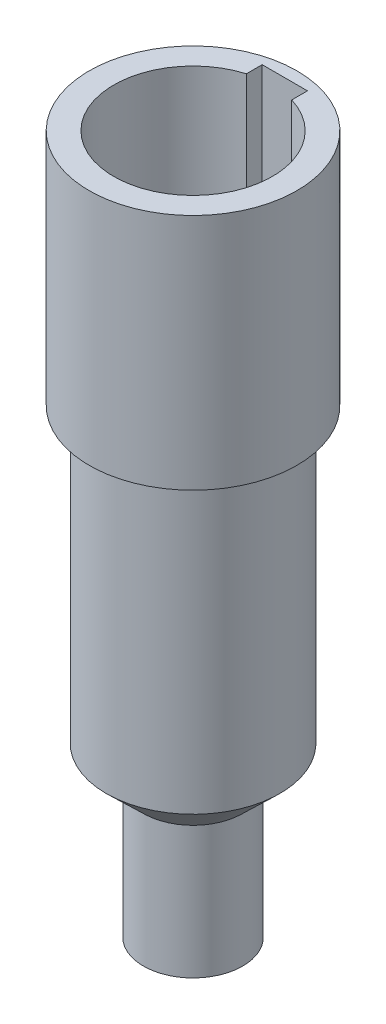
ISO-10303-21;
HEADER;
FILE_DESCRIPTION(('STEP AP214'),'2;1');
FILE_NAME('part.step','',(''),(''),'','','');
FILE_SCHEMA(('AUTOMOTIVE_DESIGN { 1 0 10303 214 1 1 1 1 }'));
ENDSEC;
DATA;
#1=APPLICATION_CONTEXT('core data for automotive mechanical design processes');
#2=APPLICATION_PROTOCOL_DEFINITION('international standard','automotive_design',2000,#1);
#3=PRODUCT_CONTEXT('',#1,'mechanical');
#4=PRODUCT('Part','Part','',(#3));
#5=PRODUCT_RELATED_PRODUCT_CATEGORY('part','',(#4));
#6=PRODUCT_DEFINITION_FORMATION('','',#4);
#7=PRODUCT_DEFINITION_CONTEXT('part definition',#1,'design');
#8=PRODUCT_DEFINITION('design','',#6,#7);
#9=PRODUCT_DEFINITION_SHAPE('','',#8);
#10=(LENGTH_UNIT() NAMED_UNIT(*) SI_UNIT(.MILLI.,.METRE.));
#11=(NAMED_UNIT(*) PLANE_ANGLE_UNIT() SI_UNIT($,.RADIAN.));
#12=(NAMED_UNIT(*) SI_UNIT($,.STERADIAN.) SOLID_ANGLE_UNIT());
#13=UNCERTAINTY_MEASURE_WITH_UNIT(LENGTH_MEASURE(1.E-05),#10,'distance_accuracy_value','');
#14=(GEOMETRIC_REPRESENTATION_CONTEXT(3) GLOBAL_UNCERTAINTY_ASSIGNED_CONTEXT((#13)) GLOBAL_UNIT_ASSIGNED_CONTEXT((#10,
#11,#12)) REPRESENTATION_CONTEXT('',''));
#15=CARTESIAN_POINT('',(0.,0.,0.));
#16=DIRECTION('',(0.,0.,1.));
#17=DIRECTION('',(1.,0.,0.));
#18=AXIS2_PLACEMENT_3D('',#15,#16,#17);
#19=CARTESIAN_POINT('',(0.,0.,0.));
#20=DIRECTION('',(0.,1.,0.));
#21=DIRECTION('',(0.,0.,1.));
#22=AXIS2_PLACEMENT_3D('',#19,#20,#21);
#23=PLANE('',#22);
#24=CARTESIAN_POINT('',(0.,0.,0.));
#25=DIRECTION('',(0.,-1.,0.));
#26=DIRECTION('',(0.,0.,-1.));
#27=AXIS2_PLACEMENT_3D('',#24,#25,#26);
#28=CIRCLE('',#27,13.15);
#29=CARTESIAN_POINT('',(0.,0.,-13.15));
#30=VERTEX_POINT('',#29);
#31=EDGE_CURVE('E13',#30,#30,#28,.T.);
#32=ORIENTED_EDGE('',*,*,#31,.T.);
#33=EDGE_LOOP('',(#32));
#34=FACE_BOUND('',#33,.T.);
#35=ADVANCED_FACE('F44',(#34),#23,.F.);
#36=CARTESIAN_POINT('',(0.,0.,0.));
#37=DIRECTION('',(0.,-1.,0.));
#38=DIRECTION('',(0.,0.,-1.));
#39=AXIS2_PLACEMENT_3D('',#36,#37,#38);
#40=CYLINDRICAL_SURFACE('',#39,13.15);
#41=ORIENTED_EDGE('',*,*,#31,.F.);
#42=EDGE_LOOP('',(#41));
#43=FACE_BOUND('',#42,.T.);
#44=CARTESIAN_POINT('',(0.,35.,0.));
#45=DIRECTION('',(0.,-1.,0.));
#46=DIRECTION('',(0.,0.,-1.));
#47=AXIS2_PLACEMENT_3D('',#44,#45,#46);
#48=CIRCLE('',#47,13.15);
#49=CARTESIAN_POINT('',(0.,35.,-13.15));
#50=VERTEX_POINT('',#49);
#51=EDGE_CURVE('E51',#50,#50,#48,.T.);
#52=ORIENTED_EDGE('',*,*,#51,.T.);
#53=EDGE_LOOP('',(#52));
#54=FACE_BOUND('',#53,.T.);
#55=ADVANCED_FACE('F134',(#43,#54),#40,.T.);
#56=CARTESIAN_POINT('',(0.,44.5,0.));
#57=DIRECTION('',(0.,1.,0.));
#58=DIRECTION('',(0.,0.,1.));
#59=AXIS2_PLACEMENT_3D('',#56,#57,#58);
#60=CONICAL_SURFACE('',#59,23.,0.803484046477467);
#61=ORIENTED_EDGE('',*,*,#51,.F.);
#62=EDGE_LOOP('',(#61));
#63=FACE_BOUND('',#62,.T.);
#64=CARTESIAN_POINT('',(0.,44.5,0.));
#65=DIRECTION('',(0.,-1.,0.));
#66=DIRECTION('',(0.,0.,-1.));
#67=AXIS2_PLACEMENT_3D('',#64,#65,#66);
#68=CIRCLE('',#67,23.);
#69=CARTESIAN_POINT('',(0.,44.5,-23.));
#70=VERTEX_POINT('',#69);
#71=EDGE_CURVE('E129',#70,#70,#68,.T.);
#72=ORIENTED_EDGE('',*,*,#71,.T.);
#73=EDGE_LOOP('',(#72));
#74=FACE_BOUND('',#73,.T.);
#75=ADVANCED_FACE('F136',(#63,#74),#60,.T.);
#76=CARTESIAN_POINT('',(0.,0.,0.));
#77=DIRECTION('',(0.,-1.,0.));
#78=DIRECTION('',(0.,0.,-1.));
#79=AXIS2_PLACEMENT_3D('',#76,#77,#78);
#80=CYLINDRICAL_SURFACE('',#79,23.);
#81=ORIENTED_EDGE('',*,*,#71,.F.);
#82=EDGE_LOOP('',(#81));
#83=FACE_BOUND('',#82,.T.);
#84=CARTESIAN_POINT('',(0.,122.,0.));
#85=DIRECTION('',(0.,-1.,0.));
#86=DIRECTION('',(0.,0.,-1.));
#87=AXIS2_PLACEMENT_3D('',#84,#85,#86);
#88=CIRCLE('',#87,23.);
#89=CARTESIAN_POINT('',(0.,122.,-23.));
#90=VERTEX_POINT('',#89);
#91=EDGE_CURVE('E126',#90,#90,#88,.T.);
#92=ORIENTED_EDGE('',*,*,#91,.T.);
#93=EDGE_LOOP('',(#92));
#94=FACE_BOUND('',#93,.T.);
#95=ADVANCED_FACE('F139',(#83,#94),#80,.T.);
#96=CARTESIAN_POINT('',(-23.,122.,0.));
#97=DIRECTION('',(0.,1.,0.));
#98=DIRECTION('',(0.,0.,1.));
#99=AXIS2_PLACEMENT_3D('',#96,#97,#98);
#100=PLANE('',#99);
#101=ORIENTED_EDGE('',*,*,#91,.F.);
#102=EDGE_LOOP('',(#101));
#103=FACE_BOUND('',#102,.T.);
#104=CARTESIAN_POINT('',(0.,122.,0.));
#105=DIRECTION('',(0.,-1.,0.));
#106=DIRECTION('',(0.,0.,-1.));
#107=AXIS2_PLACEMENT_3D('',#104,#105,#106);
#108=CIRCLE('',#107,27.5);
#109=CARTESIAN_POINT('',(0.,122.,-27.5));
#110=VERTEX_POINT('',#109);
#111=EDGE_CURVE('E123',#110,#110,#108,.T.);
#112=ORIENTED_EDGE('',*,*,#111,.T.);
#113=EDGE_LOOP('',(#112));
#114=FACE_BOUND('',#113,.T.);
#115=ADVANCED_FACE('F145',(#103,#114),#100,.F.);
#116=CARTESIAN_POINT('',(0.,0.,0.));
#117=DIRECTION('',(0.,-1.,0.));
#118=DIRECTION('',(0.,0.,-1.));
#119=AXIS2_PLACEMENT_3D('',#116,#117,#118);
#120=CYLINDRICAL_SURFACE('',#119,27.5);
#121=ORIENTED_EDGE('',*,*,#111,.F.);
#122=EDGE_LOOP('',(#121));
#123=FACE_BOUND('',#122,.T.);
#124=CARTESIAN_POINT('',(0.,185.,0.));
#125=DIRECTION('',(0.,-1.,0.));
#126=DIRECTION('',(0.,0.,-1.));
#127=AXIS2_PLACEMENT_3D('',#124,#125,#126);
#128=CIRCLE('',#127,27.5);
#129=CARTESIAN_POINT('',(0.,185.,-27.5));
#130=VERTEX_POINT('',#129);
#131=EDGE_CURVE('E119',#130,#130,#128,.T.);
#132=ORIENTED_EDGE('',*,*,#131,.T.);
#133=EDGE_LOOP('',(#132));
#134=FACE_BOUND('',#133,.T.);
#135=ADVANCED_FACE('F151',(#123,#134),#120,.T.);
#136=CARTESIAN_POINT('',(-27.5,185.,0.));
#137=DIRECTION('',(0.,-1.,0.));
#138=DIRECTION('',(0.,0.,-1.));
#139=AXIS2_PLACEMENT_3D('',#136,#137,#138);
#140=PLANE('',#139);
#141=DIRECTION('',(-1.,0.,0.));
#142=VECTOR('',#141,1.);
#143=CARTESIAN_POINT('',(6.,185.,-24.3));
#144=LINE('',#143,#142);
#145=CARTESIAN_POINT('',(6.,185.,-24.3));
#146=VERTEX_POINT('',#145);
#147=CARTESIAN_POINT('',(-6.,185.,-24.3));
#148=VERTEX_POINT('',#147);
#149=EDGE_CURVE('E91',#146,#148,#144,.T.);
#150=ORIENTED_EDGE('',*,*,#149,.F.);
#151=DIRECTION('',(0.,0.,-1.));
#152=VECTOR('',#151,1.);
#153=CARTESIAN_POINT('',(6.,185.,-16.));
#154=LINE('',#153,#152);
#155=CARTESIAN_POINT('',(6.,185.,-20.1246117974981));
#156=VERTEX_POINT('',#155);
#157=EDGE_CURVE('E83',#156,#146,#154,.T.);
#158=ORIENTED_EDGE('',*,*,#157,.F.);
#159=CARTESIAN_POINT('',(0.,185.,0.));
#160=DIRECTION('',(0.,1.,0.));
#161=DIRECTION('',(0.,0.,1.));
#162=AXIS2_PLACEMENT_3D('',#159,#160,#161);
#163=CIRCLE('',#162,21.);
#164=CARTESIAN_POINT('',(-6.,185.,-20.1246117974981));
#165=VERTEX_POINT('',#164);
#166=EDGE_CURVE('E116',#165,#156,#163,.T.);
#167=ORIENTED_EDGE('',*,*,#166,.F.);
#168=DIRECTION('',(0.,0.,1.));
#169=VECTOR('',#168,1.);
#170=CARTESIAN_POINT('',(-6.,185.,-16.));
#171=LINE('',#170,#169);
#172=EDGE_CURVE('E101',#148,#165,#171,.T.);
#173=ORIENTED_EDGE('',*,*,#172,.F.);
#174=EDGE_LOOP('',(#150,#158,#167,#173));
#175=FACE_BOUND('',#174,.T.);
#176=ORIENTED_EDGE('',*,*,#131,.F.);
#177=EDGE_LOOP('',(#176));
#178=FACE_BOUND('',#177,.T.);
#179=ADVANCED_FACE('F103',(#175,#178),#140,.F.);
#180=CARTESIAN_POINT('',(0.,128.,0.));
#181=DIRECTION('',(0.,1.,0.));
#182=DIRECTION('',(0.,0.,1.));
#183=AXIS2_PLACEMENT_3D('',#180,#181,#182);
#184=CYLINDRICAL_SURFACE('',#183,21.);
#185=ORIENTED_EDGE('',*,*,#166,.T.);
#186=DIRECTION('',(0.,1.,0.));
#187=VECTOR('',#186,1.);
#188=CARTESIAN_POINT('',(6.,128.,-20.1246117974981));
#189=LINE('',#188,#187);
#190=CARTESIAN_POINT('',(6.,128.,-20.1246117974981));
#191=VERTEX_POINT('',#190);
#192=EDGE_CURVE('E66',#156,#191,#189,.F.);
#193=ORIENTED_EDGE('',*,*,#192,.T.);
#194=CARTESIAN_POINT('',(0.,128.,0.));
#195=DIRECTION('',(0.,1.,0.));
#196=DIRECTION('',(0.,0.,1.));
#197=AXIS2_PLACEMENT_3D('',#194,#195,#196);
#198=CIRCLE('',#197,21.);
#199=CARTESIAN_POINT('',(-6.,128.,-20.1246117974981));
#200=VERTEX_POINT('',#199);
#201=EDGE_CURVE('E117',#200,#191,#198,.T.);
#202=ORIENTED_EDGE('',*,*,#201,.F.);
#203=DIRECTION('',(0.,1.,0.));
#204=VECTOR('',#203,1.);
#205=CARTESIAN_POINT('',(-6.,128.,-20.1246117974981));
#206=LINE('',#205,#204);
#207=EDGE_CURVE('E111',#200,#165,#206,.T.);
#208=ORIENTED_EDGE('',*,*,#207,.T.);
#209=EDGE_LOOP('',(#185,#193,#202,#208));
#210=FACE_BOUND('',#209,.T.);
#211=ADVANCED_FACE('F160',(#210),#184,.F.);
#212=CARTESIAN_POINT('',(0.,128.,0.));
#213=DIRECTION('',(0.,1.,0.));
#214=DIRECTION('',(0.,0.,1.));
#215=AXIS2_PLACEMENT_3D('',#212,#213,#214);
#216=PLANE('',#215);
#217=ORIENTED_EDGE('',*,*,#201,.T.);
#218=DIRECTION('',(0.,0.,1.));
#219=VECTOR('',#218,1.);
#220=CARTESIAN_POINT('',(6.,128.,-16.));
#221=LINE('',#220,#219);
#222=CARTESIAN_POINT('',(6.,128.,-24.3));
#223=VERTEX_POINT('',#222);
#224=EDGE_CURVE('E112',#223,#191,#221,.T.);
#225=ORIENTED_EDGE('',*,*,#224,.F.);
#226=DIRECTION('',(1.,0.,0.));
#227=VECTOR('',#226,1.);
#228=CARTESIAN_POINT('',(6.,128.,-24.3));
#229=LINE('',#228,#227);
#230=CARTESIAN_POINT('',(-6.,128.,-24.3));
#231=VERTEX_POINT('',#230);
#232=EDGE_CURVE('E98',#231,#223,#229,.T.);
#233=ORIENTED_EDGE('',*,*,#232,.F.);
#234=DIRECTION('',(0.,0.,-1.));
#235=VECTOR('',#234,1.);
#236=CARTESIAN_POINT('',(-6.,128.,-16.));
#237=LINE('',#236,#235);
#238=EDGE_CURVE('E58',#200,#231,#237,.T.);
#239=ORIENTED_EDGE('',*,*,#238,.F.);
#240=EDGE_LOOP('',(#217,#225,#233,#239));
#241=FACE_BOUND('',#240,.T.);
#242=ADVANCED_FACE('F166',(#241),#216,.T.);
#243=CARTESIAN_POINT('',(6.,113.409249505252,-16.));
#244=DIRECTION('',(1.,0.,0.));
#245=DIRECTION('',(0.,0.,-1.));
#246=AXIS2_PLACEMENT_3D('',#243,#244,#245);
#247=PLANE('',#246);
#248=ORIENTED_EDGE('',*,*,#157,.T.);
#249=DIRECTION('',(0.,1.,0.));
#250=VECTOR('',#249,1.);
#251=CARTESIAN_POINT('',(6.,113.409249505252,-24.3));
#252=LINE('',#251,#250);
#253=EDGE_CURVE('E86',#223,#146,#252,.T.);
#254=ORIENTED_EDGE('',*,*,#253,.F.);
#255=ORIENTED_EDGE('',*,*,#224,.T.);
#256=ORIENTED_EDGE('',*,*,#192,.F.);
#257=EDGE_LOOP('',(#248,#254,#255,#256));
#258=FACE_BOUND('',#257,.T.);
#259=ADVANCED_FACE('F85',(#258),#247,.F.);
#260=CARTESIAN_POINT('',(-6.,113.409249505252,-16.));
#261=DIRECTION('',(-1.,0.,0.));
#262=DIRECTION('',(0.,0.,1.));
#263=AXIS2_PLACEMENT_3D('',#260,#261,#262);
#264=PLANE('',#263);
#265=ORIENTED_EDGE('',*,*,#238,.T.);
#266=DIRECTION('',(0.,1.,0.));
#267=VECTOR('',#266,1.);
#268=CARTESIAN_POINT('',(-6.,113.409249505252,-24.3));
#269=LINE('',#268,#267);
#270=EDGE_CURVE('E100',#231,#148,#269,.T.);
#271=ORIENTED_EDGE('',*,*,#270,.T.);
#272=ORIENTED_EDGE('',*,*,#172,.T.);
#273=ORIENTED_EDGE('',*,*,#207,.F.);
#274=EDGE_LOOP('',(#265,#271,#272,#273));
#275=FACE_BOUND('',#274,.T.);
#276=ADVANCED_FACE('F216',(#275),#264,.F.);
#277=CARTESIAN_POINT('',(6.,113.409249505252,-24.3));
#278=DIRECTION('',(0.,0.,-1.));
#279=DIRECTION('',(-1.,0.,0.));
#280=AXIS2_PLACEMENT_3D('',#277,#278,#279);
#281=PLANE('',#280);
#282=ORIENTED_EDGE('',*,*,#232,.T.);
#283=ORIENTED_EDGE('',*,*,#253,.T.);
#284=ORIENTED_EDGE('',*,*,#149,.T.);
#285=ORIENTED_EDGE('',*,*,#270,.F.);
#286=EDGE_LOOP('',(#282,#283,#284,#285));
#287=FACE_BOUND('',#286,.T.);
#288=ADVANCED_FACE('F95',(#287),#281,.F.);
#289=CLOSED_SHELL('',(#35,#55,#75,#95,#115,#135,#179,#211,#242,#259,#276,#288));
#290=MANIFOLD_SOLID_BREP('B2',#289);
#291=ADVANCED_BREP_SHAPE_REPRESENTATION('',(#18,#290),#14);
#292=SHAPE_DEFINITION_REPRESENTATION(#9,#291);
ENDSEC;
END-ISO-10303-21;
